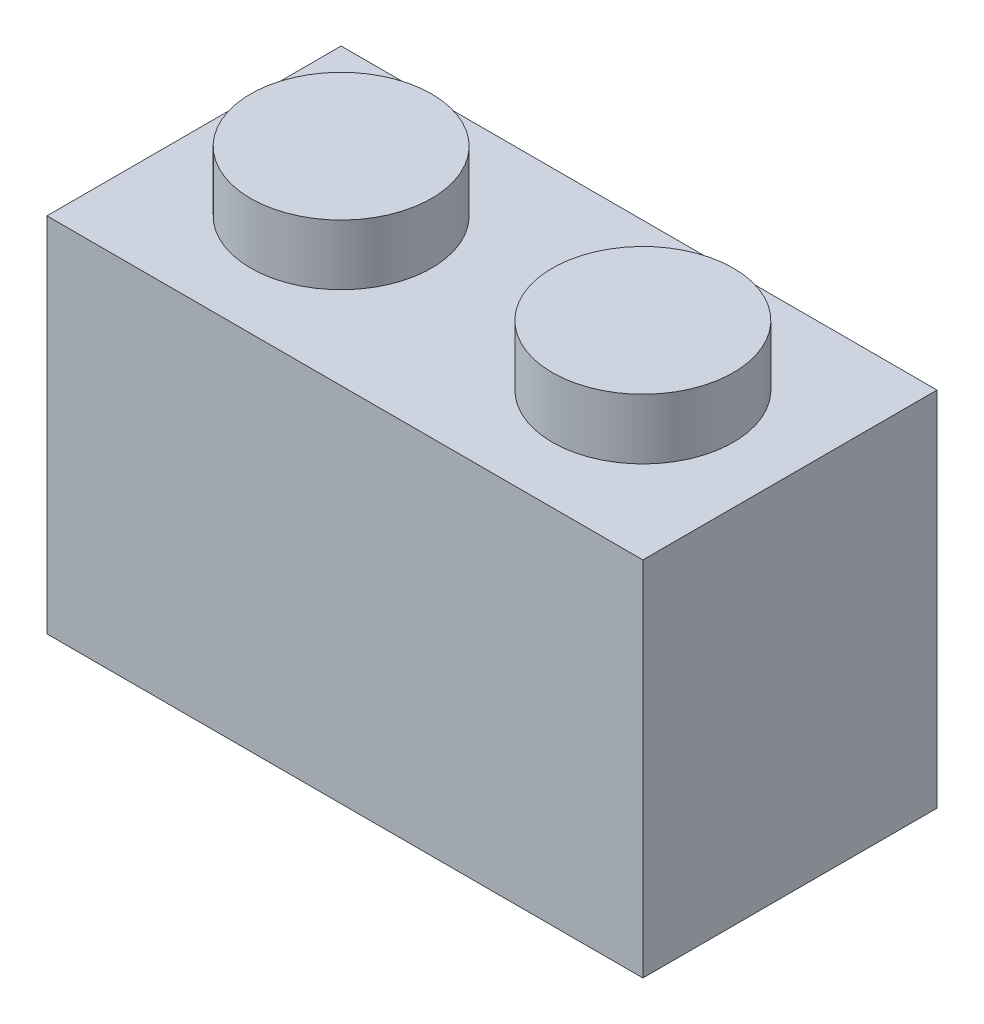
ISO-10303-21;
HEADER;
FILE_DESCRIPTION(('STEP AP214'),'2;1');
FILE_NAME('part.step','',(''),(''),'','','');
FILE_SCHEMA(('AUTOMOTIVE_DESIGN { 1 0 10303 214 1 1 1 1 }'));
ENDSEC;
DATA;
#1=APPLICATION_CONTEXT('core data for automotive mechanical design processes');
#2=APPLICATION_PROTOCOL_DEFINITION('international standard','automotive_design',2000,#1);
#3=PRODUCT_CONTEXT('',#1,'mechanical');
#4=PRODUCT('Part','Part','',(#3));
#5=PRODUCT_RELATED_PRODUCT_CATEGORY('part','',(#4));
#6=PRODUCT_DEFINITION_FORMATION('','',#4);
#7=PRODUCT_DEFINITION_CONTEXT('part definition',#1,'design');
#8=PRODUCT_DEFINITION('design','',#6,#7);
#9=PRODUCT_DEFINITION_SHAPE('','',#8);
#10=(LENGTH_UNIT() NAMED_UNIT(*) SI_UNIT(.MILLI.,.METRE.));
#11=(NAMED_UNIT(*) PLANE_ANGLE_UNIT() SI_UNIT($,.RADIAN.));
#12=(NAMED_UNIT(*) SI_UNIT($,.STERADIAN.) SOLID_ANGLE_UNIT());
#13=UNCERTAINTY_MEASURE_WITH_UNIT(LENGTH_MEASURE(1.E-05),#10,'distance_accuracy_value','');
#14=(GEOMETRIC_REPRESENTATION_CONTEXT(3) GLOBAL_UNCERTAINTY_ASSIGNED_CONTEXT((#13)) GLOBAL_UNIT_ASSIGNED_CONTEXT((#10,
#11,#12)) REPRESENTATION_CONTEXT('',''));
#15=CARTESIAN_POINT('',(0.,0.,0.));
#16=DIRECTION('',(0.,0.,1.));
#17=DIRECTION('',(1.,0.,0.));
#18=AXIS2_PLACEMENT_3D('',#15,#16,#17);
#19=CARTESIAN_POINT('',(0.,0.,-7.8));
#20=DIRECTION('',(0.,-1.,0.));
#21=DIRECTION('',(0.,0.,-1.));
#22=AXIS2_PLACEMENT_3D('',#19,#20,#21);
#23=PLANE('',#22);
#24=DIRECTION('',(1.,0.,0.));
#25=VECTOR('',#24,1.);
#26=CARTESIAN_POINT('',(0.,0.,0.));
#27=LINE('',#26,#25);
#28=CARTESIAN_POINT('',(0.,0.,0.));
#29=VERTEX_POINT('',#28);
#30=CARTESIAN_POINT('',(15.8,0.,0.));
#31=VERTEX_POINT('',#30);
#32=EDGE_CURVE('E206',#29,#31,#27,.T.);
#33=ORIENTED_EDGE('',*,*,#32,.F.);
#34=DIRECTION('',(0.,0.,1.));
#35=VECTOR('',#34,1.);
#36=CARTESIAN_POINT('',(0.,0.,-7.8));
#37=LINE('',#36,#35);
#38=CARTESIAN_POINT('',(0.,0.,-7.8));
#39=VERTEX_POINT('',#38);
#40=EDGE_CURVE('E214',#39,#29,#37,.T.);
#41=ORIENTED_EDGE('',*,*,#40,.F.);
#42=DIRECTION('',(1.,0.,0.));
#43=VECTOR('',#42,1.);
#44=CARTESIAN_POINT('',(0.,0.,-7.8));
#45=LINE('',#44,#43);
#46=CARTESIAN_POINT('',(15.8,0.,-7.8));
#47=VERTEX_POINT('',#46);
#48=EDGE_CURVE('E192',#39,#47,#45,.T.);
#49=ORIENTED_EDGE('',*,*,#48,.T.);
#50=DIRECTION('',(0.,0.,1.));
#51=VECTOR('',#50,1.);
#52=CARTESIAN_POINT('',(15.8,0.,-7.8));
#53=LINE('',#52,#51);
#54=EDGE_CURVE('E217',#47,#31,#53,.T.);
#55=ORIENTED_EDGE('',*,*,#54,.T.);
#56=EDGE_LOOP('',(#33,#41,#49,#55));
#57=FACE_BOUND('',#56,.T.);
#58=DIRECTION('',(0.,0.,1.));
#59=VECTOR('',#58,1.);
#60=CARTESIAN_POINT('',(1.2,0.,-7.8));
#61=LINE('',#60,#59);
#62=CARTESIAN_POINT('',(1.2,0.,-6.6));
#63=VERTEX_POINT('',#62);
#64=CARTESIAN_POINT('',(1.2,0.,-1.2));
#65=VERTEX_POINT('',#64);
#66=EDGE_CURVE('E169',#63,#65,#61,.T.);
#67=ORIENTED_EDGE('',*,*,#66,.T.);
#68=DIRECTION('',(1.,0.,0.));
#69=VECTOR('',#68,1.);
#70=CARTESIAN_POINT('',(0.,0.,-1.2));
#71=LINE('',#70,#69);
#72=CARTESIAN_POINT('',(14.6,0.,-1.2));
#73=VERTEX_POINT('',#72);
#74=EDGE_CURVE('E144',#65,#73,#71,.T.);
#75=ORIENTED_EDGE('',*,*,#74,.T.);
#76=DIRECTION('',(0.,0.,1.));
#77=VECTOR('',#76,1.);
#78=CARTESIAN_POINT('',(14.6,0.,-7.8));
#79=LINE('',#78,#77);
#80=CARTESIAN_POINT('',(14.6,0.,-6.6));
#81=VERTEX_POINT('',#80);
#82=EDGE_CURVE('E128',#81,#73,#79,.T.);
#83=ORIENTED_EDGE('',*,*,#82,.F.);
#84=DIRECTION('',(1.,0.,0.));
#85=VECTOR('',#84,1.);
#86=CARTESIAN_POINT('',(0.,0.,-6.6));
#87=LINE('',#86,#85);
#88=EDGE_CURVE('E56',#63,#81,#87,.T.);
#89=ORIENTED_EDGE('',*,*,#88,.F.);
#90=EDGE_LOOP('',(#67,#75,#83,#89));
#91=FACE_BOUND('',#90,.T.);
#92=ADVANCED_FACE('F40',(#57,#91),#23,.T.);
#93=CARTESIAN_POINT('',(0.,9.6,-7.8));
#94=DIRECTION('',(0.,-1.,0.));
#95=DIRECTION('',(0.,0.,-1.));
#96=AXIS2_PLACEMENT_3D('',#93,#94,#95);
#97=PLANE('',#96);
#98=CARTESIAN_POINT('',(11.9,9.6,-3.9));
#99=DIRECTION('',(0.,-1.,0.));
#100=DIRECTION('',(0.,0.,-1.));
#101=AXIS2_PLACEMENT_3D('',#98,#99,#100);
#102=CIRCLE('',#101,2.4);
#103=CARTESIAN_POINT('',(11.9,9.6,-6.3));
#104=VERTEX_POINT('',#103);
#105=EDGE_CURVE('E12',#104,#104,#102,.F.);
#106=ORIENTED_EDGE('',*,*,#105,.F.);
#107=EDGE_LOOP('',(#106));
#108=FACE_BOUND('',#107,.T.);
#109=CARTESIAN_POINT('',(3.9,9.6,-3.9));
#110=DIRECTION('',(0.,-1.,0.));
#111=DIRECTION('',(0.,0.,-1.));
#112=AXIS2_PLACEMENT_3D('',#109,#110,#111);
#113=CIRCLE('',#112,2.4);
#114=CARTESIAN_POINT('',(3.9,9.6,-6.3));
#115=VERTEX_POINT('',#114);
#116=EDGE_CURVE('E49',#115,#115,#113,.F.);
#117=ORIENTED_EDGE('',*,*,#116,.F.);
#118=EDGE_LOOP('',(#117));
#119=FACE_BOUND('',#118,.T.);
#120=DIRECTION('',(1.,0.,0.));
#121=VECTOR('',#120,1.);
#122=CARTESIAN_POINT('',(0.,9.6,0.));
#123=LINE('',#122,#121);
#124=CARTESIAN_POINT('',(0.,9.6,0.));
#125=VERTEX_POINT('',#124);
#126=CARTESIAN_POINT('',(15.8,9.6,0.));
#127=VERTEX_POINT('',#126);
#128=EDGE_CURVE('E185',#125,#127,#123,.T.);
#129=ORIENTED_EDGE('',*,*,#128,.T.);
#130=DIRECTION('',(0.,0.,1.));
#131=VECTOR('',#130,1.);
#132=CARTESIAN_POINT('',(15.8,9.6,-7.8));
#133=LINE('',#132,#131);
#134=CARTESIAN_POINT('',(15.8,9.6,-7.8));
#135=VERTEX_POINT('',#134);
#136=EDGE_CURVE('E220',#135,#127,#133,.T.);
#137=ORIENTED_EDGE('',*,*,#136,.F.);
#138=DIRECTION('',(1.,0.,0.));
#139=VECTOR('',#138,1.);
#140=CARTESIAN_POINT('',(0.,9.6,-7.8));
#141=LINE('',#140,#139);
#142=CARTESIAN_POINT('',(0.,9.6,-7.8));
#143=VERTEX_POINT('',#142);
#144=EDGE_CURVE('E91',#143,#135,#141,.T.);
#145=ORIENTED_EDGE('',*,*,#144,.F.);
#146=DIRECTION('',(0.,0.,1.));
#147=VECTOR('',#146,1.);
#148=CARTESIAN_POINT('',(0.,9.6,-7.8));
#149=LINE('',#148,#147);
#150=EDGE_CURVE('E198',#143,#125,#149,.T.);
#151=ORIENTED_EDGE('',*,*,#150,.T.);
#152=EDGE_LOOP('',(#129,#137,#145,#151));
#153=FACE_BOUND('',#152,.T.);
#154=ADVANCED_FACE('F42',(#108,#119,#153),#97,.F.);
#155=CARTESIAN_POINT('',(15.8,0.,-7.8));
#156=DIRECTION('',(1.,0.,0.));
#157=DIRECTION('',(0.,0.,-1.));
#158=AXIS2_PLACEMENT_3D('',#155,#156,#157);
#159=PLANE('',#158);
#160=DIRECTION('',(0.,1.,0.));
#161=VECTOR('',#160,1.);
#162=CARTESIAN_POINT('',(15.8,0.,0.));
#163=LINE('',#162,#161);
#164=EDGE_CURVE('E202',#31,#127,#163,.T.);
#165=ORIENTED_EDGE('',*,*,#164,.F.);
#166=ORIENTED_EDGE('',*,*,#54,.F.);
#167=DIRECTION('',(0.,1.,0.));
#168=VECTOR('',#167,1.);
#169=CARTESIAN_POINT('',(15.8,0.,-7.8));
#170=LINE('',#169,#168);
#171=EDGE_CURVE('E188',#47,#135,#170,.T.);
#172=ORIENTED_EDGE('',*,*,#171,.T.);
#173=ORIENTED_EDGE('',*,*,#136,.T.);
#174=EDGE_LOOP('',(#165,#166,#172,#173));
#175=FACE_BOUND('',#174,.T.);
#176=ADVANCED_FACE('F230',(#175),#159,.T.);
#177=CARTESIAN_POINT('',(0.,0.,-7.8));
#178=DIRECTION('',(1.,0.,0.));
#179=DIRECTION('',(0.,0.,-1.));
#180=AXIS2_PLACEMENT_3D('',#177,#178,#179);
#181=PLANE('',#180);
#182=DIRECTION('',(0.,1.,0.));
#183=VECTOR('',#182,1.);
#184=CARTESIAN_POINT('',(0.,0.,0.));
#185=LINE('',#184,#183);
#186=EDGE_CURVE('E86',#29,#125,#185,.T.);
#187=ORIENTED_EDGE('',*,*,#186,.T.);
#188=ORIENTED_EDGE('',*,*,#150,.F.);
#189=DIRECTION('',(0.,1.,0.));
#190=VECTOR('',#189,1.);
#191=CARTESIAN_POINT('',(0.,0.,-7.8));
#192=LINE('',#191,#190);
#193=EDGE_CURVE('E65',#39,#143,#192,.T.);
#194=ORIENTED_EDGE('',*,*,#193,.F.);
#195=ORIENTED_EDGE('',*,*,#40,.T.);
#196=EDGE_LOOP('',(#187,#188,#194,#195));
#197=FACE_BOUND('',#196,.T.);
#198=ADVANCED_FACE('F241',(#197),#181,.F.);
#199=CARTESIAN_POINT('',(0.,0.,-7.8));
#200=DIRECTION('',(0.,0.,1.));
#201=DIRECTION('',(1.,0.,0.));
#202=AXIS2_PLACEMENT_3D('',#199,#200,#201);
#203=PLANE('',#202);
#204=ORIENTED_EDGE('',*,*,#144,.T.);
#205=ORIENTED_EDGE('',*,*,#171,.F.);
#206=ORIENTED_EDGE('',*,*,#48,.F.);
#207=ORIENTED_EDGE('',*,*,#193,.T.);
#208=EDGE_LOOP('',(#204,#205,#206,#207));
#209=FACE_BOUND('',#208,.T.);
#210=ADVANCED_FACE('F238',(#209),#203,.F.);
#211=CARTESIAN_POINT('',(0.,0.,0.));
#212=DIRECTION('',(0.,0.,1.));
#213=DIRECTION('',(1.,0.,0.));
#214=AXIS2_PLACEMENT_3D('',#211,#212,#213);
#215=PLANE('',#214);
#216=ORIENTED_EDGE('',*,*,#128,.F.);
#217=ORIENTED_EDGE('',*,*,#186,.F.);
#218=ORIENTED_EDGE('',*,*,#32,.T.);
#219=ORIENTED_EDGE('',*,*,#164,.T.);
#220=EDGE_LOOP('',(#216,#217,#218,#219));
#221=FACE_BOUND('',#220,.T.);
#222=ADVANCED_FACE('F235',(#221),#215,.T.);
#223=CARTESIAN_POINT('',(3.9,11.2,-3.9));
#224=DIRECTION('',(0.,-1.,0.));
#225=DIRECTION('',(0.,0.,-1.));
#226=AXIS2_PLACEMENT_3D('',#223,#224,#225);
#227=CYLINDRICAL_SURFACE('',#226,2.4);
#228=CARTESIAN_POINT('',(3.9,11.2,-3.9));
#229=DIRECTION('',(0.,1.,0.));
#230=DIRECTION('',(0.,0.,1.));
#231=AXIS2_PLACEMENT_3D('',#228,#229,#230);
#232=CIRCLE('',#231,2.4);
#233=CARTESIAN_POINT('',(3.9,11.2,-1.5));
#234=VERTEX_POINT('',#233);
#235=EDGE_CURVE('E180',#234,#234,#232,.T.);
#236=ORIENTED_EDGE('',*,*,#235,.F.);
#237=EDGE_LOOP('',(#236));
#238=FACE_BOUND('',#237,.T.);
#239=ORIENTED_EDGE('',*,*,#116,.T.);
#240=EDGE_LOOP('',(#239));
#241=FACE_BOUND('',#240,.T.);
#242=ADVANCED_FACE('F226',(#238,#241),#227,.T.);
#243=CARTESIAN_POINT('',(3.9,11.2,-3.9));
#244=DIRECTION('',(0.,1.,0.));
#245=DIRECTION('',(0.,0.,1.));
#246=AXIS2_PLACEMENT_3D('',#243,#244,#245);
#247=PLANE('',#246);
#248=ORIENTED_EDGE('',*,*,#235,.T.);
#249=EDGE_LOOP('',(#248));
#250=FACE_BOUND('',#249,.T.);
#251=ADVANCED_FACE('F291',(#250),#247,.T.);
#252=CARTESIAN_POINT('',(11.9,11.2,-3.9));
#253=DIRECTION('',(0.,-1.,0.));
#254=DIRECTION('',(0.,0.,-1.));
#255=AXIS2_PLACEMENT_3D('',#252,#253,#254);
#256=CYLINDRICAL_SURFACE('',#255,2.4);
#257=CARTESIAN_POINT('',(11.9,11.2,-3.9));
#258=DIRECTION('',(0.,1.,0.));
#259=DIRECTION('',(0.,0.,1.));
#260=AXIS2_PLACEMENT_3D('',#257,#258,#259);
#261=CIRCLE('',#260,2.4);
#262=CARTESIAN_POINT('',(11.9,11.2,-1.5));
#263=VERTEX_POINT('',#262);
#264=EDGE_CURVE('E176',#263,#263,#261,.T.);
#265=ORIENTED_EDGE('',*,*,#264,.F.);
#266=EDGE_LOOP('',(#265));
#267=FACE_BOUND('',#266,.T.);
#268=ORIENTED_EDGE('',*,*,#105,.T.);
#269=EDGE_LOOP('',(#268));
#270=FACE_BOUND('',#269,.T.);
#271=ADVANCED_FACE('F300',(#267,#270),#256,.T.);
#272=CARTESIAN_POINT('',(11.9,11.2,-3.9));
#273=DIRECTION('',(0.,1.,0.));
#274=DIRECTION('',(0.,0.,1.));
#275=AXIS2_PLACEMENT_3D('',#272,#273,#274);
#276=PLANE('',#275);
#277=ORIENTED_EDGE('',*,*,#264,.T.);
#278=EDGE_LOOP('',(#277));
#279=FACE_BOUND('',#278,.T.);
#280=ADVANCED_FACE('F310',(#279),#276,.T.);
#281=CARTESIAN_POINT('',(0.,8.4,-7.8));
#282=DIRECTION('',(0.,-1.,0.));
#283=DIRECTION('',(0.,0.,-1.));
#284=AXIS2_PLACEMENT_3D('',#281,#282,#283);
#285=PLANE('',#284);
#286=CARTESIAN_POINT('',(7.9,8.4,-3.9));
#287=DIRECTION('',(0.,-1.,0.));
#288=DIRECTION('',(0.,0.,-1.));
#289=AXIS2_PLACEMENT_3D('',#286,#287,#288);
#290=CIRCLE('',#289,1.5);
#291=CARTESIAN_POINT('',(7.9,8.4,-5.4));
#292=VERTEX_POINT('',#291);
#293=EDGE_CURVE('E432',#292,#292,#290,.T.);
#294=ORIENTED_EDGE('',*,*,#293,.F.);
#295=EDGE_LOOP('',(#294));
#296=FACE_BOUND('',#295,.T.);
#297=CARTESIAN_POINT('',(11.9,8.4,-3.9));
#298=DIRECTION('',(0.,-1.,0.));
#299=DIRECTION('',(0.,0.,-1.));
#300=AXIS2_PLACEMENT_3D('',#297,#298,#299);
#301=CIRCLE('',#300,1.2);
#302=CARTESIAN_POINT('',(11.9,8.4,-5.1));
#303=VERTEX_POINT('',#302);
#304=EDGE_CURVE('E181',#303,#303,#301,.F.);
#305=ORIENTED_EDGE('',*,*,#304,.T.);
#306=EDGE_LOOP('',(#305));
#307=FACE_BOUND('',#306,.T.);
#308=CARTESIAN_POINT('',(3.9,8.4,-3.9));
#309=DIRECTION('',(0.,-1.,0.));
#310=DIRECTION('',(0.,0.,-1.));
#311=AXIS2_PLACEMENT_3D('',#308,#309,#310);
#312=CIRCLE('',#311,1.2);
#313=CARTESIAN_POINT('',(3.9,8.4,-5.1));
#314=VERTEX_POINT('',#313);
#315=EDGE_CURVE('E127',#314,#314,#312,.F.);
#316=ORIENTED_EDGE('',*,*,#315,.T.);
#317=EDGE_LOOP('',(#316));
#318=FACE_BOUND('',#317,.T.);
#319=DIRECTION('',(1.,0.,0.));
#320=VECTOR('',#319,1.);
#321=CARTESIAN_POINT('',(0.,8.4,-1.2));
#322=LINE('',#321,#320);
#323=CARTESIAN_POINT('',(1.2,8.4,-1.2));
#324=VERTEX_POINT('',#323);
#325=CARTESIAN_POINT('',(14.6,8.4,-1.2));
#326=VERTEX_POINT('',#325);
#327=EDGE_CURVE('E121',#324,#326,#322,.T.);
#328=ORIENTED_EDGE('',*,*,#327,.F.);
#329=DIRECTION('',(0.,0.,1.));
#330=VECTOR('',#329,1.);
#331=CARTESIAN_POINT('',(1.2,8.4,-7.8));
#332=LINE('',#331,#330);
#333=CARTESIAN_POINT('',(1.2,8.4,-6.6));
#334=VERTEX_POINT('',#333);
#335=EDGE_CURVE('E150',#334,#324,#332,.T.);
#336=ORIENTED_EDGE('',*,*,#335,.F.);
#337=DIRECTION('',(1.,0.,0.));
#338=VECTOR('',#337,1.);
#339=CARTESIAN_POINT('',(0.,8.4,-6.6));
#340=LINE('',#339,#338);
#341=CARTESIAN_POINT('',(14.6,8.4,-6.6));
#342=VERTEX_POINT('',#341);
#343=EDGE_CURVE('E123',#334,#342,#340,.T.);
#344=ORIENTED_EDGE('',*,*,#343,.T.);
#345=DIRECTION('',(0.,0.,1.));
#346=VECTOR('',#345,1.);
#347=CARTESIAN_POINT('',(14.6,8.4,-7.8));
#348=LINE('',#347,#346);
#349=EDGE_CURVE('E117',#342,#326,#348,.T.);
#350=ORIENTED_EDGE('',*,*,#349,.T.);
#351=EDGE_LOOP('',(#328,#336,#344,#350));
#352=FACE_BOUND('',#351,.T.);
#353=ADVANCED_FACE('F119',(#296,#307,#318,#352),#285,.T.);
#354=CARTESIAN_POINT('',(14.6,0.,-7.8));
#355=DIRECTION('',(1.,0.,0.));
#356=DIRECTION('',(0.,0.,-1.));
#357=AXIS2_PLACEMENT_3D('',#354,#355,#356);
#358=PLANE('',#357);
#359=DIRECTION('',(0.,1.,0.));
#360=VECTOR('',#359,1.);
#361=CARTESIAN_POINT('',(14.6,0.,-1.2));
#362=LINE('',#361,#360);
#363=EDGE_CURVE('E134',#73,#326,#362,.T.);
#364=ORIENTED_EDGE('',*,*,#363,.T.);
#365=ORIENTED_EDGE('',*,*,#349,.F.);
#366=DIRECTION('',(0.,1.,0.));
#367=VECTOR('',#366,1.);
#368=CARTESIAN_POINT('',(14.6,0.,-6.6));
#369=LINE('',#368,#367);
#370=EDGE_CURVE('E152',#81,#342,#369,.T.);
#371=ORIENTED_EDGE('',*,*,#370,.F.);
#372=ORIENTED_EDGE('',*,*,#82,.T.);
#373=EDGE_LOOP('',(#364,#365,#371,#372));
#374=FACE_BOUND('',#373,.T.);
#375=ADVANCED_FACE('F141',(#374),#358,.F.);
#376=CARTESIAN_POINT('',(1.2,0.,-7.8));
#377=DIRECTION('',(1.,0.,0.));
#378=DIRECTION('',(0.,0.,-1.));
#379=AXIS2_PLACEMENT_3D('',#376,#377,#378);
#380=PLANE('',#379);
#381=DIRECTION('',(0.,1.,0.));
#382=VECTOR('',#381,1.);
#383=CARTESIAN_POINT('',(1.2,0.,-1.2));
#384=LINE('',#383,#382);
#385=EDGE_CURVE('E136',#65,#324,#384,.T.);
#386=ORIENTED_EDGE('',*,*,#385,.F.);
#387=ORIENTED_EDGE('',*,*,#66,.F.);
#388=DIRECTION('',(0.,1.,0.));
#389=VECTOR('',#388,1.);
#390=CARTESIAN_POINT('',(1.2,0.,-6.6));
#391=LINE('',#390,#389);
#392=EDGE_CURVE('E155',#63,#334,#391,.T.);
#393=ORIENTED_EDGE('',*,*,#392,.T.);
#394=ORIENTED_EDGE('',*,*,#335,.T.);
#395=EDGE_LOOP('',(#386,#387,#393,#394));
#396=FACE_BOUND('',#395,.T.);
#397=ADVANCED_FACE('F331',(#396),#380,.T.);
#398=CARTESIAN_POINT('',(0.,0.,-6.6));
#399=DIRECTION('',(0.,0.,1.));
#400=DIRECTION('',(1.,0.,0.));
#401=AXIS2_PLACEMENT_3D('',#398,#399,#400);
#402=PLANE('',#401);
#403=ORIENTED_EDGE('',*,*,#343,.F.);
#404=ORIENTED_EDGE('',*,*,#392,.F.);
#405=ORIENTED_EDGE('',*,*,#88,.T.);
#406=ORIENTED_EDGE('',*,*,#370,.T.);
#407=EDGE_LOOP('',(#403,#404,#405,#406));
#408=FACE_BOUND('',#407,.T.);
#409=ADVANCED_FACE('F338',(#408),#402,.T.);
#410=CARTESIAN_POINT('',(0.,0.,-1.2));
#411=DIRECTION('',(0.,0.,1.));
#412=DIRECTION('',(1.,0.,0.));
#413=AXIS2_PLACEMENT_3D('',#410,#411,#412);
#414=PLANE('',#413);
#415=ORIENTED_EDGE('',*,*,#327,.T.);
#416=ORIENTED_EDGE('',*,*,#363,.F.);
#417=ORIENTED_EDGE('',*,*,#74,.F.);
#418=ORIENTED_EDGE('',*,*,#385,.T.);
#419=EDGE_LOOP('',(#415,#416,#417,#418));
#420=FACE_BOUND('',#419,.T.);
#421=ADVANCED_FACE('F132',(#420),#414,.F.);
#422=CARTESIAN_POINT('',(3.9,11.2,-3.9));
#423=DIRECTION('',(0.,-1.,0.));
#424=DIRECTION('',(0.,0.,-1.));
#425=AXIS2_PLACEMENT_3D('',#422,#423,#424);
#426=CYLINDRICAL_SURFACE('',#425,1.2);
#427=CARTESIAN_POINT('',(3.9,10.,-3.9));
#428=DIRECTION('',(0.,1.,0.));
#429=DIRECTION('',(0.,0.,1.));
#430=AXIS2_PLACEMENT_3D('',#427,#428,#429);
#431=CIRCLE('',#430,1.2);
#432=CARTESIAN_POINT('',(3.9,10.,-2.7));
#433=VERTEX_POINT('',#432);
#434=EDGE_CURVE('E139',#433,#433,#431,.T.);
#435=ORIENTED_EDGE('',*,*,#434,.T.);
#436=EDGE_LOOP('',(#435));
#437=FACE_BOUND('',#436,.T.);
#438=ORIENTED_EDGE('',*,*,#315,.F.);
#439=EDGE_LOOP('',(#438));
#440=FACE_BOUND('',#439,.T.);
#441=ADVANCED_FACE('F352',(#437,#440),#426,.F.);
#442=CARTESIAN_POINT('',(3.9,10.,-3.9));
#443=DIRECTION('',(0.,1.,0.));
#444=DIRECTION('',(0.,0.,1.));
#445=AXIS2_PLACEMENT_3D('',#442,#443,#444);
#446=PLANE('',#445);
#447=ORIENTED_EDGE('',*,*,#434,.F.);
#448=EDGE_LOOP('',(#447));
#449=FACE_BOUND('',#448,.T.);
#450=ADVANCED_FACE('F359',(#449),#446,.F.);
#451=CARTESIAN_POINT('',(11.9,11.2,-3.9));
#452=DIRECTION('',(0.,-1.,0.));
#453=DIRECTION('',(0.,0.,-1.));
#454=AXIS2_PLACEMENT_3D('',#451,#452,#453);
#455=CYLINDRICAL_SURFACE('',#454,1.2);
#456=CARTESIAN_POINT('',(11.9,10.,-3.9));
#457=DIRECTION('',(0.,1.,0.));
#458=DIRECTION('',(0.,0.,1.));
#459=AXIS2_PLACEMENT_3D('',#456,#457,#458);
#460=CIRCLE('',#459,1.2);
#461=CARTESIAN_POINT('',(11.9,10.,-2.7));
#462=VERTEX_POINT('',#461);
#463=EDGE_CURVE('E163',#462,#462,#460,.T.);
#464=ORIENTED_EDGE('',*,*,#463,.T.);
#465=EDGE_LOOP('',(#464));
#466=FACE_BOUND('',#465,.T.);
#467=ORIENTED_EDGE('',*,*,#304,.F.);
#468=EDGE_LOOP('',(#467));
#469=FACE_BOUND('',#468,.T.);
#470=ADVANCED_FACE('F367',(#466,#469),#455,.F.);
#471=CARTESIAN_POINT('',(11.9,10.,-3.9));
#472=DIRECTION('',(0.,1.,0.));
#473=DIRECTION('',(0.,0.,1.));
#474=AXIS2_PLACEMENT_3D('',#471,#472,#473);
#475=PLANE('',#474);
#476=ORIENTED_EDGE('',*,*,#463,.F.);
#477=EDGE_LOOP('',(#476));
#478=FACE_BOUND('',#477,.T.);
#479=ADVANCED_FACE('F375',(#478),#475,.F.);
#480=CARTESIAN_POINT('',(7.9,-4.24264068711928,-3.9));
#481=DIRECTION('',(0.,1.,0.));
#482=DIRECTION('',(0.,0.,1.));
#483=AXIS2_PLACEMENT_3D('',#480,#481,#482);
#484=CYLINDRICAL_SURFACE('',#483,1.5);
#485=ORIENTED_EDGE('',*,*,#293,.T.);
#486=EDGE_LOOP('',(#485));
#487=FACE_BOUND('',#486,.T.);
#488=CARTESIAN_POINT('',(7.9,0.2,-3.9));
#489=DIRECTION('',(0.,-1.,0.));
#490=DIRECTION('',(0.,0.,-1.));
#491=AXIS2_PLACEMENT_3D('',#488,#489,#490);
#492=CIRCLE('',#491,1.5);
#493=CARTESIAN_POINT('',(7.9,0.2,-5.4));
#494=VERTEX_POINT('',#493);
#495=EDGE_CURVE('E167',#494,#494,#492,.T.);
#496=ORIENTED_EDGE('',*,*,#495,.F.);
#497=EDGE_LOOP('',(#496));
#498=FACE_BOUND('',#497,.T.);
#499=ADVANCED_FACE('F382',(#487,#498),#484,.T.);
#500=CARTESIAN_POINT('',(0.,0.2,-7.8));
#501=DIRECTION('',(0.,-1.,0.));
#502=DIRECTION('',(0.,0.,-1.));
#503=AXIS2_PLACEMENT_3D('',#500,#501,#502);
#504=PLANE('',#503);
#505=ORIENTED_EDGE('',*,*,#495,.T.);
#506=EDGE_LOOP('',(#505));
#507=FACE_BOUND('',#506,.T.);
#508=ADVANCED_FACE('F389',(#507),#504,.T.);
#509=CLOSED_SHELL('',(#92,#154,#176,#198,#210,#222,#242,#251,#271,#280,#353,#375,#397,#409,#421,
#441,#450,#470,#479,#499,#508));
#510=MANIFOLD_SOLID_BREP('B2',#509);
#511=ADVANCED_BREP_SHAPE_REPRESENTATION('',(#18,#510),#14);
#512=SHAPE_DEFINITION_REPRESENTATION(#9,#511);
ENDSEC;
END-ISO-10303-21;
